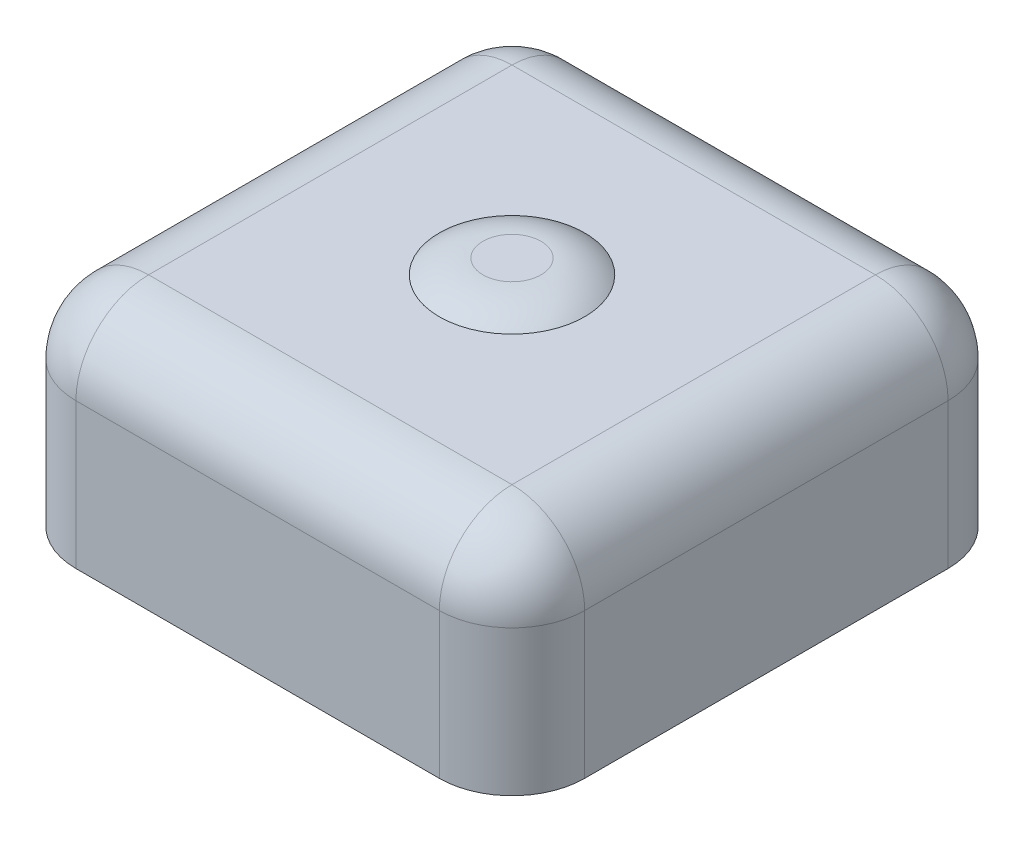
ISO-10303-21;
HEADER;
FILE_DESCRIPTION(('STEP AP214'),'2;1');
FILE_NAME('part.step','',(''),(''),'','','');
FILE_SCHEMA(('AUTOMOTIVE_DESIGN { 1 0 10303 214 1 1 1 1 }'));
ENDSEC;
DATA;
#1=APPLICATION_CONTEXT('core data for automotive mechanical design processes');
#2=APPLICATION_PROTOCOL_DEFINITION('international standard','automotive_design',2000,#1);
#3=PRODUCT_CONTEXT('',#1,'mechanical');
#4=PRODUCT('Part','Part','',(#3));
#5=PRODUCT_RELATED_PRODUCT_CATEGORY('part','',(#4));
#6=PRODUCT_DEFINITION_FORMATION('','',#4);
#7=PRODUCT_DEFINITION_CONTEXT('part definition',#1,'design');
#8=PRODUCT_DEFINITION('design','',#6,#7);
#9=PRODUCT_DEFINITION_SHAPE('','',#8);
#10=(LENGTH_UNIT() NAMED_UNIT(*) SI_UNIT(.MILLI.,.METRE.));
#11=(NAMED_UNIT(*) PLANE_ANGLE_UNIT() SI_UNIT($,.RADIAN.));
#12=(NAMED_UNIT(*) SI_UNIT($,.STERADIAN.) SOLID_ANGLE_UNIT());
#13=UNCERTAINTY_MEASURE_WITH_UNIT(LENGTH_MEASURE(1.E-05),#10,'distance_accuracy_value','');
#14=(GEOMETRIC_REPRESENTATION_CONTEXT(3) GLOBAL_UNCERTAINTY_ASSIGNED_CONTEXT((#13)) GLOBAL_UNIT_ASSIGNED_CONTEXT((#10,
#11,#12)) REPRESENTATION_CONTEXT('',''));
#15=CARTESIAN_POINT('',(0.,0.,0.));
#16=DIRECTION('',(0.,0.,1.));
#17=DIRECTION('',(1.,0.,0.));
#18=AXIS2_PLACEMENT_3D('',#15,#16,#17);
#19=CARTESIAN_POINT('',(3.5,3.,-3.5));
#20=DIRECTION('',(-1.,0.,0.));
#21=DIRECTION('',(0.,0.,1.));
#22=AXIS2_PLACEMENT_3D('',#19,#20,#21);
#23=PLANE('',#22);
#24=DIRECTION('',(0.,0.,-1.));
#25=VECTOR('',#24,1.);
#26=CARTESIAN_POINT('',(3.5,0.,-3.5));
#27=LINE('',#26,#25);
#28=CARTESIAN_POINT('',(3.5,0.,2.5));
#29=VERTEX_POINT('',#28);
#30=CARTESIAN_POINT('',(3.5,0.,-2.5));
#31=VERTEX_POINT('',#30);
#32=EDGE_CURVE('E142',#29,#31,#27,.T.);
#33=ORIENTED_EDGE('',*,*,#32,.T.);
#34=DIRECTION('',(0.,-1.,0.));
#35=VECTOR('',#34,1.);
#36=CARTESIAN_POINT('',(3.5,3.,-2.5));
#37=LINE('',#36,#35);
#38=CARTESIAN_POINT('',(3.5,2.,-2.5));
#39=VERTEX_POINT('',#38);
#40=EDGE_CURVE('E120',#31,#39,#37,.F.);
#41=ORIENTED_EDGE('',*,*,#40,.T.);
#42=DIRECTION('',(0.,0.,-1.));
#43=VECTOR('',#42,1.);
#44=CARTESIAN_POINT('',(3.5,2.,3.5));
#45=LINE('',#44,#43);
#46=CARTESIAN_POINT('',(3.5,2.,2.5));
#47=VERTEX_POINT('',#46);
#48=EDGE_CURVE('E125',#39,#47,#45,.F.);
#49=ORIENTED_EDGE('',*,*,#48,.T.);
#50=DIRECTION('',(0.,-1.,0.));
#51=VECTOR('',#50,1.);
#52=CARTESIAN_POINT('',(3.5,3.,2.5));
#53=LINE('',#52,#51);
#54=EDGE_CURVE('E160',#47,#29,#53,.T.);
#55=ORIENTED_EDGE('',*,*,#54,.T.);
#56=EDGE_LOOP('',(#33,#41,#49,#55));
#57=FACE_BOUND('',#56,.T.);
#58=ADVANCED_FACE('F35',(#57),#23,.F.);
#59=CARTESIAN_POINT('',(-3.5,3.,-3.5));
#60=DIRECTION('',(0.,0.,1.));
#61=DIRECTION('',(1.,0.,0.));
#62=AXIS2_PLACEMENT_3D('',#59,#60,#61);
#63=PLANE('',#62);
#64=DIRECTION('',(-1.,0.,0.));
#65=VECTOR('',#64,1.);
#66=CARTESIAN_POINT('',(3.5,2.,-3.5));
#67=LINE('',#66,#65);
#68=CARTESIAN_POINT('',(-2.5,2.,-3.5));
#69=VERTEX_POINT('',#68);
#70=CARTESIAN_POINT('',(2.5,2.,-3.5));
#71=VERTEX_POINT('',#70);
#72=EDGE_CURVE('E133',#69,#71,#67,.F.);
#73=ORIENTED_EDGE('',*,*,#72,.T.);
#74=DIRECTION('',(0.,-1.,0.));
#75=VECTOR('',#74,1.);
#76=CARTESIAN_POINT('',(2.5,3.,-3.5));
#77=LINE('',#76,#75);
#78=CARTESIAN_POINT('',(2.5,0.,-3.5));
#79=VERTEX_POINT('',#78);
#80=EDGE_CURVE('E119',#71,#79,#77,.T.);
#81=ORIENTED_EDGE('',*,*,#80,.T.);
#82=DIRECTION('',(-1.,0.,0.));
#83=VECTOR('',#82,1.);
#84=CARTESIAN_POINT('',(-3.5,0.,-3.5));
#85=LINE('',#84,#83);
#86=CARTESIAN_POINT('',(-2.5,0.,-3.5));
#87=VERTEX_POINT('',#86);
#88=EDGE_CURVE('E131',#79,#87,#85,.T.);
#89=ORIENTED_EDGE('',*,*,#88,.T.);
#90=DIRECTION('',(0.,-1.,0.));
#91=VECTOR('',#90,1.);
#92=CARTESIAN_POINT('',(-2.5,3.,-3.5));
#93=LINE('',#92,#91);
#94=EDGE_CURVE('E136',#87,#69,#93,.F.);
#95=ORIENTED_EDGE('',*,*,#94,.T.);
#96=EDGE_LOOP('',(#73,#81,#89,#95));
#97=FACE_BOUND('',#96,.T.);
#98=ADVANCED_FACE('F130',(#97),#63,.F.);
#99=CARTESIAN_POINT('',(-3.5,3.,-3.5));
#100=DIRECTION('',(1.,0.,0.));
#101=DIRECTION('',(0.,0.,-1.));
#102=AXIS2_PLACEMENT_3D('',#99,#100,#101);
#103=PLANE('',#102);
#104=DIRECTION('',(0.,0.,1.));
#105=VECTOR('',#104,1.);
#106=CARTESIAN_POINT('',(-3.5,2.,-3.5));
#107=LINE('',#106,#105);
#108=CARTESIAN_POINT('',(-3.5,2.,2.5));
#109=VERTEX_POINT('',#108);
#110=CARTESIAN_POINT('',(-3.5,2.,-2.5));
#111=VERTEX_POINT('',#110);
#112=EDGE_CURVE('E163',#109,#111,#107,.F.);
#113=ORIENTED_EDGE('',*,*,#112,.T.);
#114=DIRECTION('',(0.,-1.,0.));
#115=VECTOR('',#114,1.);
#116=CARTESIAN_POINT('',(-3.5,3.,-2.5));
#117=LINE('',#116,#115);
#118=CARTESIAN_POINT('',(-3.5,0.,-2.5));
#119=VERTEX_POINT('',#118);
#120=EDGE_CURVE('E167',#111,#119,#117,.T.);
#121=ORIENTED_EDGE('',*,*,#120,.T.);
#122=DIRECTION('',(0.,0.,1.));
#123=VECTOR('',#122,1.);
#124=CARTESIAN_POINT('',(-3.5,0.,-3.5));
#125=LINE('',#124,#123);
#126=CARTESIAN_POINT('',(-3.5,0.,2.5));
#127=VERTEX_POINT('',#126);
#128=EDGE_CURVE('E141',#119,#127,#125,.T.);
#129=ORIENTED_EDGE('',*,*,#128,.T.);
#130=DIRECTION('',(0.,-1.,0.));
#131=VECTOR('',#130,1.);
#132=CARTESIAN_POINT('',(-3.5,3.,2.5));
#133=LINE('',#132,#131);
#134=EDGE_CURVE('E165',#127,#109,#133,.F.);
#135=ORIENTED_EDGE('',*,*,#134,.T.);
#136=EDGE_LOOP('',(#113,#121,#129,#135));
#137=FACE_BOUND('',#136,.T.);
#138=ADVANCED_FACE('F251',(#137),#103,.F.);
#139=CARTESIAN_POINT('',(-3.5,3.,3.5));
#140=DIRECTION('',(0.,0.,-1.));
#141=DIRECTION('',(-1.,0.,0.));
#142=AXIS2_PLACEMENT_3D('',#139,#140,#141);
#143=PLANE('',#142);
#144=DIRECTION('',(1.,0.,0.));
#145=VECTOR('',#144,1.);
#146=CARTESIAN_POINT('',(-3.5,2.,3.5));
#147=LINE('',#146,#145);
#148=CARTESIAN_POINT('',(2.5,2.,3.5));
#149=VERTEX_POINT('',#148);
#150=CARTESIAN_POINT('',(-2.5,2.,3.5));
#151=VERTEX_POINT('',#150);
#152=EDGE_CURVE('E169',#149,#151,#147,.F.);
#153=ORIENTED_EDGE('',*,*,#152,.T.);
#154=DIRECTION('',(0.,-1.,0.));
#155=VECTOR('',#154,1.);
#156=CARTESIAN_POINT('',(-2.5,3.,3.5));
#157=LINE('',#156,#155);
#158=CARTESIAN_POINT('',(-2.5,0.,3.5));
#159=VERTEX_POINT('',#158);
#160=EDGE_CURVE('E173',#151,#159,#157,.T.);
#161=ORIENTED_EDGE('',*,*,#160,.T.);
#162=DIRECTION('',(1.,0.,0.));
#163=VECTOR('',#162,1.);
#164=CARTESIAN_POINT('',(-3.5,0.,3.5));
#165=LINE('',#164,#163);
#166=CARTESIAN_POINT('',(2.5,0.,3.5));
#167=VERTEX_POINT('',#166);
#168=EDGE_CURVE('E145',#159,#167,#165,.T.);
#169=ORIENTED_EDGE('',*,*,#168,.T.);
#170=DIRECTION('',(0.,-1.,0.));
#171=VECTOR('',#170,1.);
#172=CARTESIAN_POINT('',(2.5,3.,3.5));
#173=LINE('',#172,#171);
#174=EDGE_CURVE('E171',#167,#149,#173,.F.);
#175=ORIENTED_EDGE('',*,*,#174,.T.);
#176=EDGE_LOOP('',(#153,#161,#169,#175));
#177=FACE_BOUND('',#176,.T.);
#178=ADVANCED_FACE('F256',(#177),#143,.F.);
#179=CARTESIAN_POINT('',(0.,3.,0.));
#180=DIRECTION('',(0.,1.,0.));
#181=DIRECTION('',(0.,0.,1.));
#182=AXIS2_PLACEMENT_3D('',#179,#180,#181);
#183=PLANE('',#182);
#184=CARTESIAN_POINT('',(0.,3.,0.));
#185=DIRECTION('',(0.,1.,0.));
#186=DIRECTION('',(0.,0.,1.));
#187=AXIS2_PLACEMENT_3D('',#184,#185,#186);
#188=CIRCLE('',#187,1.);
#189=CARTESIAN_POINT('',(0.,3.,1.));
#190=VERTEX_POINT('',#189);
#191=EDGE_CURVE('E184',#190,#190,#188,.T.);
#192=ORIENTED_EDGE('',*,*,#191,.F.);
#193=EDGE_LOOP('',(#192));
#194=FACE_BOUND('',#193,.T.);
#195=DIRECTION('',(0.,0.,-1.));
#196=VECTOR('',#195,1.);
#197=CARTESIAN_POINT('',(2.5,3.,-3.5));
#198=LINE('',#197,#196);
#199=CARTESIAN_POINT('',(2.5,3.,2.5));
#200=VERTEX_POINT('',#199);
#201=CARTESIAN_POINT('',(2.5,3.,-2.5));
#202=VERTEX_POINT('',#201);
#203=EDGE_CURVE('E175',#200,#202,#198,.T.);
#204=ORIENTED_EDGE('',*,*,#203,.T.);
#205=DIRECTION('',(-1.,0.,0.));
#206=VECTOR('',#205,1.);
#207=CARTESIAN_POINT('',(-3.5,3.,-2.5));
#208=LINE('',#207,#206);
#209=CARTESIAN_POINT('',(-2.5,3.,-2.5));
#210=VERTEX_POINT('',#209);
#211=EDGE_CURVE('E43',#202,#210,#208,.T.);
#212=ORIENTED_EDGE('',*,*,#211,.T.);
#213=DIRECTION('',(0.,0.,1.));
#214=VECTOR('',#213,1.);
#215=CARTESIAN_POINT('',(-2.5,3.,3.5));
#216=LINE('',#215,#214);
#217=CARTESIAN_POINT('',(-2.5,3.,2.5));
#218=VERTEX_POINT('',#217);
#219=EDGE_CURVE('E58',#210,#218,#216,.T.);
#220=ORIENTED_EDGE('',*,*,#219,.T.);
#221=DIRECTION('',(1.,0.,0.));
#222=VECTOR('',#221,1.);
#223=CARTESIAN_POINT('',(3.5,3.,2.5));
#224=LINE('',#223,#222);
#225=EDGE_CURVE('E177',#218,#200,#224,.T.);
#226=ORIENTED_EDGE('',*,*,#225,.T.);
#227=EDGE_LOOP('',(#204,#212,#220,#226));
#228=FACE_BOUND('',#227,.T.);
#229=ADVANCED_FACE('F226',(#194,#228),#183,.T.);
#230=CARTESIAN_POINT('',(0.,0.,0.));
#231=DIRECTION('',(0.,1.,0.));
#232=DIRECTION('',(0.,0.,1.));
#233=AXIS2_PLACEMENT_3D('',#230,#231,#232);
#234=PLANE('',#233);
#235=ORIENTED_EDGE('',*,*,#88,.F.);
#236=CARTESIAN_POINT('',(2.5,0.,-2.5));
#237=DIRECTION('',(0.,1.,0.));
#238=DIRECTION('',(0.,0.,1.));
#239=AXIS2_PLACEMENT_3D('',#236,#237,#238);
#240=CIRCLE('',#239,1.);
#241=EDGE_CURVE('E115',#79,#31,#240,.F.);
#242=ORIENTED_EDGE('',*,*,#241,.T.);
#243=ORIENTED_EDGE('',*,*,#32,.F.);
#244=CARTESIAN_POINT('',(2.5,0.,2.5));
#245=DIRECTION('',(0.,1.,0.));
#246=DIRECTION('',(0.,0.,1.));
#247=AXIS2_PLACEMENT_3D('',#244,#245,#246);
#248=CIRCLE('',#247,1.);
#249=EDGE_CURVE('E135',#29,#167,#248,.F.);
#250=ORIENTED_EDGE('',*,*,#249,.T.);
#251=ORIENTED_EDGE('',*,*,#168,.F.);
#252=CARTESIAN_POINT('',(-2.5,0.,2.5));
#253=DIRECTION('',(0.,1.,0.));
#254=DIRECTION('',(0.,0.,1.));
#255=AXIS2_PLACEMENT_3D('',#252,#253,#254);
#256=CIRCLE('',#255,1.);
#257=EDGE_CURVE('E156',#159,#127,#256,.F.);
#258=ORIENTED_EDGE('',*,*,#257,.T.);
#259=ORIENTED_EDGE('',*,*,#128,.F.);
#260=CARTESIAN_POINT('',(-2.5,0.,-2.5));
#261=DIRECTION('',(0.,1.,0.));
#262=DIRECTION('',(0.,0.,1.));
#263=AXIS2_PLACEMENT_3D('',#260,#261,#262);
#264=CIRCLE('',#263,1.);
#265=EDGE_CURVE('E126',#119,#87,#264,.F.);
#266=ORIENTED_EDGE('',*,*,#265,.T.);
#267=EDGE_LOOP('',(#235,#242,#243,#250,#251,#258,#259,#266));
#268=FACE_BOUND('',#267,.T.);
#269=ADVANCED_FACE('F138',(#268),#234,.F.);
#270=CARTESIAN_POINT('',(-2.5,3.,2.5));
#271=DIRECTION('',(0.,-1.,0.));
#272=DIRECTION('',(0.,0.,-1.));
#273=AXIS2_PLACEMENT_3D('',#270,#271,#272);
#274=CYLINDRICAL_SURFACE('',#273,1.);
#275=CARTESIAN_POINT('',(-2.5,2.,2.5));
#276=DIRECTION('',(0.,1.,0.));
#277=DIRECTION('',(0.,0.,1.));
#278=AXIS2_PLACEMENT_3D('',#275,#276,#277);
#279=CIRCLE('',#278,1.);
#280=EDGE_CURVE('E147',#109,#151,#279,.T.);
#281=ORIENTED_EDGE('',*,*,#280,.F.);
#282=ORIENTED_EDGE('',*,*,#134,.F.);
#283=ORIENTED_EDGE('',*,*,#257,.F.);
#284=ORIENTED_EDGE('',*,*,#160,.F.);
#285=EDGE_LOOP('',(#281,#282,#283,#284));
#286=FACE_BOUND('',#285,.T.);
#287=ADVANCED_FACE('F263',(#286),#274,.T.);
#288=CARTESIAN_POINT('',(-2.5,2.,2.5));
#289=DIRECTION('',(0.,0.,1.));
#290=DIRECTION('',(1.,0.,0.));
#291=AXIS2_PLACEMENT_3D('',#288,#289,#290);
#292=SPHERICAL_SURFACE('',#291,1.);
#293=CARTESIAN_POINT('',(-2.5,2.,2.5));
#294=DIRECTION('',(0.,0.,1.));
#295=DIRECTION('',(1.,0.,0.));
#296=AXIS2_PLACEMENT_3D('',#293,#294,#295);
#297=CIRCLE('',#296,1.);
#298=EDGE_CURVE('E205',#109,#218,#297,.F.);
#299=ORIENTED_EDGE('',*,*,#298,.F.);
#300=ORIENTED_EDGE('',*,*,#280,.T.);
#301=CARTESIAN_POINT('',(-2.5,2.,2.5));
#302=DIRECTION('',(-1.,0.,0.));
#303=DIRECTION('',(0.,0.,1.));
#304=AXIS2_PLACEMENT_3D('',#301,#302,#303);
#305=CIRCLE('',#304,1.);
#306=EDGE_CURVE('E207',#218,#151,#305,.F.);
#307=ORIENTED_EDGE('',*,*,#306,.F.);
#308=EDGE_LOOP('',(#299,#300,#307));
#309=FACE_BOUND('',#308,.T.);
#310=ADVANCED_FACE('F214',(#309),#292,.T.);
#311=CARTESIAN_POINT('',(2.5,3.,2.5));
#312=DIRECTION('',(0.,-1.,0.));
#313=DIRECTION('',(0.,0.,-1.));
#314=AXIS2_PLACEMENT_3D('',#311,#312,#313);
#315=CYLINDRICAL_SURFACE('',#314,1.);
#316=ORIENTED_EDGE('',*,*,#249,.F.);
#317=ORIENTED_EDGE('',*,*,#54,.F.);
#318=CARTESIAN_POINT('',(2.5,2.,2.5));
#319=DIRECTION('',(0.,1.,0.));
#320=DIRECTION('',(0.,0.,1.));
#321=AXIS2_PLACEMENT_3D('',#318,#319,#320);
#322=CIRCLE('',#321,1.);
#323=EDGE_CURVE('E202',#149,#47,#322,.T.);
#324=ORIENTED_EDGE('',*,*,#323,.F.);
#325=ORIENTED_EDGE('',*,*,#174,.F.);
#326=EDGE_LOOP('',(#316,#317,#324,#325));
#327=FACE_BOUND('',#326,.T.);
#328=ADVANCED_FACE('F366',(#327),#315,.T.);
#329=CARTESIAN_POINT('',(0.,2.,2.5));
#330=DIRECTION('',(-1.,0.,0.));
#331=DIRECTION('',(0.,0.,1.));
#332=AXIS2_PLACEMENT_3D('',#329,#330,#331);
#333=CYLINDRICAL_SURFACE('',#332,1.);
#334=ORIENTED_EDGE('',*,*,#306,.T.);
#335=ORIENTED_EDGE('',*,*,#152,.F.);
#336=CARTESIAN_POINT('',(2.5,2.,2.5));
#337=DIRECTION('',(1.,0.,0.));
#338=DIRECTION('',(0.,0.,-1.));
#339=AXIS2_PLACEMENT_3D('',#336,#337,#338);
#340=CIRCLE('',#339,1.);
#341=EDGE_CURVE('E199',#200,#149,#340,.T.);
#342=ORIENTED_EDGE('',*,*,#341,.F.);
#343=ORIENTED_EDGE('',*,*,#225,.F.);
#344=EDGE_LOOP('',(#334,#335,#342,#343));
#345=FACE_BOUND('',#344,.T.);
#346=ADVANCED_FACE('F222',(#345),#333,.T.);
#347=CARTESIAN_POINT('',(-2.5,2.,0.));
#348=DIRECTION('',(0.,0.,-1.));
#349=DIRECTION('',(-1.,0.,0.));
#350=AXIS2_PLACEMENT_3D('',#347,#348,#349);
#351=CYLINDRICAL_SURFACE('',#350,1.);
#352=ORIENTED_EDGE('',*,*,#298,.T.);
#353=ORIENTED_EDGE('',*,*,#219,.F.);
#354=CARTESIAN_POINT('',(-2.5,2.,-2.5));
#355=DIRECTION('',(0.,0.,-1.));
#356=DIRECTION('',(-1.,0.,0.));
#357=AXIS2_PLACEMENT_3D('',#354,#355,#356);
#358=CIRCLE('',#357,1.);
#359=EDGE_CURVE('E197',#111,#210,#358,.T.);
#360=ORIENTED_EDGE('',*,*,#359,.F.);
#361=ORIENTED_EDGE('',*,*,#112,.F.);
#362=EDGE_LOOP('',(#352,#353,#360,#361));
#363=FACE_BOUND('',#362,.T.);
#364=ADVANCED_FACE('F347',(#363),#351,.T.);
#365=CARTESIAN_POINT('',(-2.5,3.,-2.5));
#366=DIRECTION('',(0.,-1.,0.));
#367=DIRECTION('',(0.,0.,-1.));
#368=AXIS2_PLACEMENT_3D('',#365,#366,#367);
#369=CYLINDRICAL_SURFACE('',#368,1.);
#370=ORIENTED_EDGE('',*,*,#265,.F.);
#371=ORIENTED_EDGE('',*,*,#120,.F.);
#372=CARTESIAN_POINT('',(-2.5,2.,-2.5));
#373=DIRECTION('',(0.,1.,0.));
#374=DIRECTION('',(0.,0.,1.));
#375=AXIS2_PLACEMENT_3D('',#372,#373,#374);
#376=CIRCLE('',#375,1.);
#377=EDGE_CURVE('E194',#69,#111,#376,.T.);
#378=ORIENTED_EDGE('',*,*,#377,.F.);
#379=ORIENTED_EDGE('',*,*,#94,.F.);
#380=EDGE_LOOP('',(#370,#371,#378,#379));
#381=FACE_BOUND('',#380,.T.);
#382=ADVANCED_FACE('F337',(#381),#369,.T.);
#383=CARTESIAN_POINT('',(2.5,2.,2.5));
#384=DIRECTION('',(0.,0.,1.));
#385=DIRECTION('',(1.,0.,0.));
#386=AXIS2_PLACEMENT_3D('',#383,#384,#385);
#387=SPHERICAL_SURFACE('',#386,1.);
#388=ORIENTED_EDGE('',*,*,#341,.T.);
#389=ORIENTED_EDGE('',*,*,#323,.T.);
#390=CARTESIAN_POINT('',(2.5,2.,2.5));
#391=DIRECTION('',(0.,0.,1.));
#392=DIRECTION('',(0.,-1.,0.));
#393=AXIS2_PLACEMENT_3D('',#390,#391,#392);
#394=CIRCLE('',#393,1.);
#395=EDGE_CURVE('E191',#200,#47,#394,.F.);
#396=ORIENTED_EDGE('',*,*,#395,.F.);
#397=EDGE_LOOP('',(#388,#389,#396));
#398=FACE_BOUND('',#397,.T.);
#399=ADVANCED_FACE('F327',(#398),#387,.T.);
#400=CARTESIAN_POINT('',(-2.5,2.,-2.5));
#401=DIRECTION('',(0.,0.,1.));
#402=DIRECTION('',(1.,0.,0.));
#403=AXIS2_PLACEMENT_3D('',#400,#401,#402);
#404=SPHERICAL_SURFACE('',#403,1.);
#405=ORIENTED_EDGE('',*,*,#377,.T.);
#406=ORIENTED_EDGE('',*,*,#359,.T.);
#407=CARTESIAN_POINT('',(-2.5,2.,-2.5));
#408=DIRECTION('',(-1.,0.,0.));
#409=DIRECTION('',(0.,0.,1.));
#410=AXIS2_PLACEMENT_3D('',#407,#408,#409);
#411=CIRCLE('',#410,1.);
#412=EDGE_CURVE('E50',#69,#210,#411,.F.);
#413=ORIENTED_EDGE('',*,*,#412,.F.);
#414=EDGE_LOOP('',(#405,#406,#413));
#415=FACE_BOUND('',#414,.T.);
#416=ADVANCED_FACE('F318',(#415),#404,.T.);
#417=CARTESIAN_POINT('',(2.5,2.,0.));
#418=DIRECTION('',(0.,0.,1.));
#419=DIRECTION('',(1.,0.,0.));
#420=AXIS2_PLACEMENT_3D('',#417,#418,#419);
#421=CYLINDRICAL_SURFACE('',#420,1.);
#422=ORIENTED_EDGE('',*,*,#395,.T.);
#423=ORIENTED_EDGE('',*,*,#48,.F.);
#424=CARTESIAN_POINT('',(2.5,2.,-2.5));
#425=DIRECTION('',(0.,0.,-1.));
#426=DIRECTION('',(-1.,0.,0.));
#427=AXIS2_PLACEMENT_3D('',#424,#425,#426);
#428=CIRCLE('',#427,1.);
#429=EDGE_CURVE('E187',#202,#39,#428,.T.);
#430=ORIENTED_EDGE('',*,*,#429,.F.);
#431=ORIENTED_EDGE('',*,*,#203,.F.);
#432=EDGE_LOOP('',(#422,#423,#430,#431));
#433=FACE_BOUND('',#432,.T.);
#434=ADVANCED_FACE('F233',(#433),#421,.T.);
#435=CARTESIAN_POINT('',(0.,2.,-2.5));
#436=DIRECTION('',(1.,0.,0.));
#437=DIRECTION('',(0.,0.,-1.));
#438=AXIS2_PLACEMENT_3D('',#435,#436,#437);
#439=CYLINDRICAL_SURFACE('',#438,1.);
#440=ORIENTED_EDGE('',*,*,#412,.T.);
#441=ORIENTED_EDGE('',*,*,#211,.F.);
#442=CARTESIAN_POINT('',(2.5,2.,-2.5));
#443=DIRECTION('',(1.,0.,0.));
#444=DIRECTION('',(0.,0.,-1.));
#445=AXIS2_PLACEMENT_3D('',#442,#443,#444);
#446=CIRCLE('',#445,1.);
#447=EDGE_CURVE('E183',#71,#202,#446,.T.);
#448=ORIENTED_EDGE('',*,*,#447,.F.);
#449=ORIENTED_EDGE('',*,*,#72,.F.);
#450=EDGE_LOOP('',(#440,#441,#448,#449));
#451=FACE_BOUND('',#450,.T.);
#452=ADVANCED_FACE('F230',(#451),#439,.T.);
#453=CARTESIAN_POINT('',(2.5,2.,-2.5));
#454=DIRECTION('',(0.,0.,1.));
#455=DIRECTION('',(1.,0.,0.));
#456=AXIS2_PLACEMENT_3D('',#453,#454,#455);
#457=SPHERICAL_SURFACE('',#456,1.);
#458=ORIENTED_EDGE('',*,*,#447,.T.);
#459=ORIENTED_EDGE('',*,*,#429,.T.);
#460=CARTESIAN_POINT('',(2.5,2.,-2.5));
#461=DIRECTION('',(0.,1.,0.));
#462=DIRECTION('',(0.,0.,1.));
#463=AXIS2_PLACEMENT_3D('',#460,#461,#462);
#464=CIRCLE('',#463,1.);
#465=EDGE_CURVE('E181',#71,#39,#464,.F.);
#466=ORIENTED_EDGE('',*,*,#465,.F.);
#467=EDGE_LOOP('',(#458,#459,#466));
#468=FACE_BOUND('',#467,.T.);
#469=ADVANCED_FACE('F235',(#468),#457,.T.);
#470=CARTESIAN_POINT('',(2.5,3.,-2.5));
#471=DIRECTION('',(0.,-1.,0.));
#472=DIRECTION('',(0.,0.,-1.));
#473=AXIS2_PLACEMENT_3D('',#470,#471,#472);
#474=CYLINDRICAL_SURFACE('',#473,1.);
#475=ORIENTED_EDGE('',*,*,#465,.T.);
#476=ORIENTED_EDGE('',*,*,#40,.F.);
#477=ORIENTED_EDGE('',*,*,#241,.F.);
#478=ORIENTED_EDGE('',*,*,#80,.F.);
#479=EDGE_LOOP('',(#475,#476,#477,#478));
#480=FACE_BOUND('',#479,.T.);
#481=ADVANCED_FACE('F118',(#480),#474,.T.);
#482=CARTESIAN_POINT('',(0.,3.2,0.));
#483=DIRECTION('',(0.,1.,0.));
#484=DIRECTION('',(0.,0.,1.));
#485=AXIS2_PLACEMENT_3D('',#482,#483,#484);
#486=PLANE('',#485);
#487=CARTESIAN_POINT('',(0.,3.2,0.));
#488=DIRECTION('',(0.,1.,0.));
#489=DIRECTION('',(0.,0.,1.));
#490=AXIS2_PLACEMENT_3D('',#487,#488,#489);
#491=CIRCLE('',#490,0.4);
#492=CARTESIAN_POINT('',(0.,3.2,0.4));
#493=VERTEX_POINT('',#492);
#494=EDGE_CURVE('E11',#493,#493,#491,.T.);
#495=ORIENTED_EDGE('',*,*,#494,.T.);
#496=EDGE_LOOP('',(#495));
#497=FACE_BOUND('',#496,.T.);
#498=ADVANCED_FACE('F242',(#497),#486,.T.);
#499=CARTESIAN_POINT('',(0.,2.2,0.));
#500=DIRECTION('',(0.,-1.,0.));
#501=DIRECTION('',(0.,0.,-1.));
#502=AXIS2_PLACEMENT_3D('',#499,#500,#501);
#503=DEGENERATE_TOROIDAL_SURFACE('',#502,0.4,1.,.T.);
#504=ORIENTED_EDGE('',*,*,#191,.T.);
#505=EDGE_LOOP('',(#504));
#506=FACE_BOUND('',#505,.T.);
#507=ORIENTED_EDGE('',*,*,#494,.F.);
#508=EDGE_LOOP('',(#507));
#509=FACE_BOUND('',#508,.T.);
#510=ADVANCED_FACE('F37',(#506,#509),#503,.T.);
#511=CLOSED_SHELL('',(#58,#98,#138,#178,#229,#269,#287,#310,#328,#346,#364,#382,#399,#416,#434,
#452,#469,#481,#498,#510));
#512=MANIFOLD_SOLID_BREP('B2',#511);
#513=ADVANCED_BREP_SHAPE_REPRESENTATION('',(#18,#512),#14);
#514=SHAPE_DEFINITION_REPRESENTATION(#9,#513);
ENDSEC;
END-ISO-10303-21;
